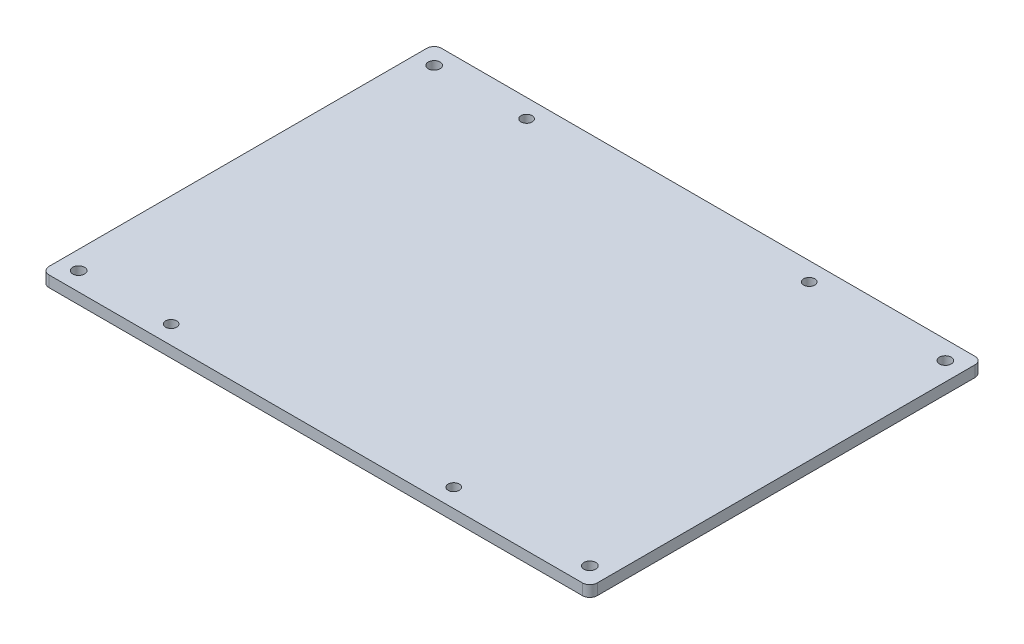
ISO-10303-21;
HEADER;
FILE_DESCRIPTION(('STEP AP214'),'2;1');
FILE_NAME('part.step','',(''),(''),'','','');
FILE_SCHEMA(('AUTOMOTIVE_DESIGN { 1 0 10303 214 1 1 1 1 }'));
ENDSEC;
DATA;
#1=APPLICATION_CONTEXT('core data for automotive mechanical design processes');
#2=APPLICATION_PROTOCOL_DEFINITION('international standard','automotive_design',2000,#1);
#3=PRODUCT_CONTEXT('',#1,'mechanical');
#4=PRODUCT('Part','Part','',(#3));
#5=PRODUCT_RELATED_PRODUCT_CATEGORY('part','',(#4));
#6=PRODUCT_DEFINITION_FORMATION('','',#4);
#7=PRODUCT_DEFINITION_CONTEXT('part definition',#1,'design');
#8=PRODUCT_DEFINITION('design','',#6,#7);
#9=PRODUCT_DEFINITION_SHAPE('','',#8);
#10=(LENGTH_UNIT() NAMED_UNIT(*) SI_UNIT(.MILLI.,.METRE.));
#11=(NAMED_UNIT(*) PLANE_ANGLE_UNIT() SI_UNIT($,.RADIAN.));
#12=(NAMED_UNIT(*) SI_UNIT($,.STERADIAN.) SOLID_ANGLE_UNIT());
#13=UNCERTAINTY_MEASURE_WITH_UNIT(LENGTH_MEASURE(1.E-05),#10,'distance_accuracy_value','');
#14=(GEOMETRIC_REPRESENTATION_CONTEXT(3) GLOBAL_UNCERTAINTY_ASSIGNED_CONTEXT((#13)) GLOBAL_UNIT_ASSIGNED_CONTEXT((#10,
#11,#12)) REPRESENTATION_CONTEXT('',''));
#15=CARTESIAN_POINT('',(0.,0.,0.));
#16=DIRECTION('',(0.,0.,1.));
#17=DIRECTION('',(1.,0.,0.));
#18=AXIS2_PLACEMENT_3D('',#15,#16,#17);
#19=CARTESIAN_POINT('',(0.,3.,0.));
#20=DIRECTION('',(0.,1.,0.));
#21=DIRECTION('',(0.,0.,1.));
#22=AXIS2_PLACEMENT_3D('',#19,#20,#21);
#23=PLANE('',#22);
#24=CARTESIAN_POINT('',(32.3000000000001,3.,-48.05));
#25=DIRECTION('',(0.,1.,0.));
#26=DIRECTION('',(0.,0.,1.));
#27=AXIS2_PLACEMENT_3D('',#24,#25,#26);
#28=CIRCLE('',#27,1.5);
#29=CARTESIAN_POINT('',(32.3000000000001,3.,-49.55));
#30=VERTEX_POINT('',#29);
#31=EDGE_CURVE('E220',#30,#30,#28,.F.);
#32=ORIENTED_EDGE('',*,*,#31,.T.);
#33=EDGE_LOOP('',(#32));
#34=FACE_BOUND('',#33,.T.);
#35=CARTESIAN_POINT('',(-44.1,3.,-48.0500000000001));
#36=DIRECTION('',(0.,1.,0.));
#37=DIRECTION('',(0.,0.,1.));
#38=AXIS2_PLACEMENT_3D('',#35,#36,#37);
#39=CIRCLE('',#38,1.5);
#40=CARTESIAN_POINT('',(-44.1,3.,-49.5500000000001));
#41=VERTEX_POINT('',#40);
#42=EDGE_CURVE('E214',#41,#41,#39,.F.);
#43=ORIENTED_EDGE('',*,*,#42,.T.);
#44=EDGE_LOOP('',(#43));
#45=FACE_BOUND('',#44,.T.);
#46=CARTESIAN_POINT('',(-44.1,3.,48.05));
#47=DIRECTION('',(0.,1.,0.));
#48=DIRECTION('',(0.,0.,1.));
#49=AXIS2_PLACEMENT_3D('',#46,#47,#48);
#50=CIRCLE('',#49,1.5);
#51=CARTESIAN_POINT('',(-44.1,3.,46.55));
#52=VERTEX_POINT('',#51);
#53=EDGE_CURVE('E208',#52,#52,#50,.F.);
#54=ORIENTED_EDGE('',*,*,#53,.T.);
#55=EDGE_LOOP('',(#54));
#56=FACE_BOUND('',#55,.T.);
#57=CARTESIAN_POINT('',(32.3,3.,48.05));
#58=DIRECTION('',(0.,1.,0.));
#59=DIRECTION('',(0.,0.,1.));
#60=AXIS2_PLACEMENT_3D('',#57,#58,#59);
#61=CIRCLE('',#60,1.5);
#62=CARTESIAN_POINT('',(32.3,3.,46.55));
#63=VERTEX_POINT('',#62);
#64=EDGE_CURVE('E202',#63,#63,#61,.F.);
#65=ORIENTED_EDGE('',*,*,#64,.T.);
#66=EDGE_LOOP('',(#65));
#67=FACE_BOUND('',#66,.T.);
#68=CARTESIAN_POINT('',(69.1,3.,48.05));
#69=DIRECTION('',(0.,1.,0.));
#70=DIRECTION('',(0.,0.,1.));
#71=AXIS2_PLACEMENT_3D('',#68,#69,#70);
#72=CIRCLE('',#71,1.60000000000001);
#73=CARTESIAN_POINT('',(69.1,3.,49.65));
#74=VERTEX_POINT('',#73);
#75=EDGE_CURVE('E187',#74,#74,#72,.T.);
#76=ORIENTED_EDGE('',*,*,#75,.F.);
#77=EDGE_LOOP('',(#76));
#78=FACE_BOUND('',#77,.T.);
#79=CARTESIAN_POINT('',(-69.1,3.,-48.05));
#80=DIRECTION('',(0.,1.,0.));
#81=DIRECTION('',(0.,0.,1.));
#82=AXIS2_PLACEMENT_3D('',#79,#80,#81);
#83=CIRCLE('',#82,1.60000000000001);
#84=CARTESIAN_POINT('',(-69.1,3.,-46.45));
#85=VERTEX_POINT('',#84);
#86=EDGE_CURVE('E173',#85,#85,#83,.T.);
#87=ORIENTED_EDGE('',*,*,#86,.F.);
#88=EDGE_LOOP('',(#87));
#89=FACE_BOUND('',#88,.T.);
#90=DIRECTION('',(1.,0.,0.));
#91=VECTOR('',#90,1.);
#92=CARTESIAN_POINT('',(-74.1,3.,53.05));
#93=LINE('',#92,#91);
#94=CARTESIAN_POINT('',(-72.1,3.,53.05));
#95=VERTEX_POINT('',#94);
#96=CARTESIAN_POINT('',(72.1,3.,53.05));
#97=VERTEX_POINT('',#96);
#98=EDGE_CURVE('E168',#95,#97,#93,.T.);
#99=ORIENTED_EDGE('',*,*,#98,.T.);
#100=CARTESIAN_POINT('',(72.1,3.,51.05));
#101=DIRECTION('',(0.,1.,0.));
#102=DIRECTION('',(0.,0.,1.));
#103=AXIS2_PLACEMENT_3D('',#100,#101,#102);
#104=CIRCLE('',#103,2.);
#105=CARTESIAN_POINT('',(74.1,3.,51.05));
#106=VERTEX_POINT('',#105);
#107=EDGE_CURVE('E149',#97,#106,#104,.T.);
#108=ORIENTED_EDGE('',*,*,#107,.T.);
#109=DIRECTION('',(0.,0.,-1.));
#110=VECTOR('',#109,1.);
#111=CARTESIAN_POINT('',(74.1,3.,-53.05));
#112=LINE('',#111,#110);
#113=CARTESIAN_POINT('',(74.1,3.,-51.05));
#114=VERTEX_POINT('',#113);
#115=EDGE_CURVE('E119',#106,#114,#112,.T.);
#116=ORIENTED_EDGE('',*,*,#115,.T.);
#117=CARTESIAN_POINT('',(72.1,3.,-51.05));
#118=DIRECTION('',(0.,1.,0.));
#119=DIRECTION('',(0.,0.,1.));
#120=AXIS2_PLACEMENT_3D('',#117,#118,#119);
#121=CIRCLE('',#120,2.);
#122=CARTESIAN_POINT('',(72.1,3.,-53.05));
#123=VERTEX_POINT('',#122);
#124=EDGE_CURVE('E55',#114,#123,#121,.T.);
#125=ORIENTED_EDGE('',*,*,#124,.T.);
#126=DIRECTION('',(-1.,0.,0.));
#127=VECTOR('',#126,1.);
#128=CARTESIAN_POINT('',(-74.1,3.,-53.05));
#129=LINE('',#128,#127);
#130=CARTESIAN_POINT('',(-72.1,3.,-53.05));
#131=VERTEX_POINT('',#130);
#132=EDGE_CURVE('E135',#123,#131,#129,.T.);
#133=ORIENTED_EDGE('',*,*,#132,.T.);
#134=CARTESIAN_POINT('',(-72.1,3.,-51.05));
#135=DIRECTION('',(0.,1.,0.));
#136=DIRECTION('',(0.,0.,1.));
#137=AXIS2_PLACEMENT_3D('',#134,#135,#136);
#138=CIRCLE('',#137,2.);
#139=CARTESIAN_POINT('',(-74.1,3.,-51.05));
#140=VERTEX_POINT('',#139);
#141=EDGE_CURVE('E146',#131,#140,#138,.T.);
#142=ORIENTED_EDGE('',*,*,#141,.T.);
#143=DIRECTION('',(0.,0.,1.));
#144=VECTOR('',#143,1.);
#145=CARTESIAN_POINT('',(-74.1,3.,-53.05));
#146=LINE('',#145,#144);
#147=CARTESIAN_POINT('',(-74.1,3.,51.05));
#148=VERTEX_POINT('',#147);
#149=EDGE_CURVE('E129',#140,#148,#146,.T.);
#150=ORIENTED_EDGE('',*,*,#149,.T.);
#151=CARTESIAN_POINT('',(-72.1,3.,51.05));
#152=DIRECTION('',(0.,1.,0.));
#153=DIRECTION('',(0.,0.,1.));
#154=AXIS2_PLACEMENT_3D('',#151,#152,#153);
#155=CIRCLE('',#154,2.);
#156=EDGE_CURVE('E144',#148,#95,#155,.T.);
#157=ORIENTED_EDGE('',*,*,#156,.T.);
#158=EDGE_LOOP('',(#99,#108,#116,#125,#133,#142,#150,#157));
#159=FACE_BOUND('',#158,.T.);
#160=CARTESIAN_POINT('',(-69.1,3.,48.05));
#161=DIRECTION('',(0.,1.,0.));
#162=DIRECTION('',(0.,0.,-1.));
#163=AXIS2_PLACEMENT_3D('',#160,#161,#162);
#164=CIRCLE('',#163,1.60000000000001);
#165=CARTESIAN_POINT('',(-69.1,3.,46.45));
#166=VERTEX_POINT('',#165);
#167=EDGE_CURVE('E182',#166,#166,#164,.T.);
#168=ORIENTED_EDGE('',*,*,#167,.F.);
#169=EDGE_LOOP('',(#168));
#170=FACE_BOUND('',#169,.T.);
#171=CARTESIAN_POINT('',(69.1,3.,-48.05));
#172=DIRECTION('',(0.,1.,0.));
#173=DIRECTION('',(0.,0.,-1.));
#174=AXIS2_PLACEMENT_3D('',#171,#172,#173);
#175=CIRCLE('',#174,1.60000000000001);
#176=CARTESIAN_POINT('',(69.1,3.,-49.65));
#177=VERTEX_POINT('',#176);
#178=EDGE_CURVE('E193',#177,#177,#175,.T.);
#179=ORIENTED_EDGE('',*,*,#178,.F.);
#180=EDGE_LOOP('',(#179));
#181=FACE_BOUND('',#180,.T.);
#182=ADVANCED_FACE('F33',(#34,#45,#56,#67,#78,#89,#159,#170,#181),#23,.T.);
#183=CARTESIAN_POINT('',(0.,0.,0.));
#184=DIRECTION('',(0.,1.,0.));
#185=DIRECTION('',(0.,0.,1.));
#186=AXIS2_PLACEMENT_3D('',#183,#184,#185);
#187=PLANE('',#186);
#188=CARTESIAN_POINT('',(32.3000000000001,0.,-48.05));
#189=DIRECTION('',(0.,-1.,0.));
#190=DIRECTION('',(0.,0.,1.));
#191=AXIS2_PLACEMENT_3D('',#188,#189,#190);
#192=CIRCLE('',#191,1.5);
#193=CARTESIAN_POINT('',(32.3000000000001,0.,-49.55));
#194=VERTEX_POINT('',#193);
#195=EDGE_CURVE('E217',#194,#194,#192,.T.);
#196=ORIENTED_EDGE('',*,*,#195,.F.);
#197=EDGE_LOOP('',(#196));
#198=FACE_BOUND('',#197,.T.);
#199=CARTESIAN_POINT('',(-44.1,0.,-48.0500000000001));
#200=DIRECTION('',(0.,-1.,0.));
#201=DIRECTION('',(0.,0.,1.));
#202=AXIS2_PLACEMENT_3D('',#199,#200,#201);
#203=CIRCLE('',#202,1.5);
#204=CARTESIAN_POINT('',(-44.1,0.,-49.5500000000001));
#205=VERTEX_POINT('',#204);
#206=EDGE_CURVE('E211',#205,#205,#203,.T.);
#207=ORIENTED_EDGE('',*,*,#206,.F.);
#208=EDGE_LOOP('',(#207));
#209=FACE_BOUND('',#208,.T.);
#210=CARTESIAN_POINT('',(-44.1,0.,48.05));
#211=DIRECTION('',(0.,-1.,0.));
#212=DIRECTION('',(0.,0.,-1.));
#213=AXIS2_PLACEMENT_3D('',#210,#211,#212);
#214=CIRCLE('',#213,1.5);
#215=CARTESIAN_POINT('',(-44.1,0.,46.55));
#216=VERTEX_POINT('',#215);
#217=EDGE_CURVE('E205',#216,#216,#214,.T.);
#218=ORIENTED_EDGE('',*,*,#217,.F.);
#219=EDGE_LOOP('',(#218));
#220=FACE_BOUND('',#219,.T.);
#221=CARTESIAN_POINT('',(32.3,0.,48.05));
#222=DIRECTION('',(0.,-1.,0.));
#223=DIRECTION('',(0.,0.,-1.));
#224=AXIS2_PLACEMENT_3D('',#221,#222,#223);
#225=CIRCLE('',#224,1.5);
#226=CARTESIAN_POINT('',(32.3,0.,46.55));
#227=VERTEX_POINT('',#226);
#228=EDGE_CURVE('E199',#227,#227,#225,.T.);
#229=ORIENTED_EDGE('',*,*,#228,.F.);
#230=EDGE_LOOP('',(#229));
#231=FACE_BOUND('',#230,.T.);
#232=DIRECTION('',(0.,0.,-1.));
#233=VECTOR('',#232,1.);
#234=CARTESIAN_POINT('',(74.1,0.,-53.05));
#235=LINE('',#234,#233);
#236=CARTESIAN_POINT('',(74.1,0.,51.05));
#237=VERTEX_POINT('',#236);
#238=CARTESIAN_POINT('',(74.1,0.,-51.05));
#239=VERTEX_POINT('',#238);
#240=EDGE_CURVE('E117',#237,#239,#235,.T.);
#241=ORIENTED_EDGE('',*,*,#240,.F.);
#242=CARTESIAN_POINT('',(72.1,0.,51.05));
#243=DIRECTION('',(0.,1.,0.));
#244=DIRECTION('',(0.,0.,1.));
#245=AXIS2_PLACEMENT_3D('',#242,#243,#244);
#246=CIRCLE('',#245,2.);
#247=CARTESIAN_POINT('',(72.1,0.,53.05));
#248=VERTEX_POINT('',#247);
#249=EDGE_CURVE('E100',#237,#248,#246,.F.);
#250=ORIENTED_EDGE('',*,*,#249,.T.);
#251=DIRECTION('',(1.,0.,0.));
#252=VECTOR('',#251,1.);
#253=CARTESIAN_POINT('',(-74.1,0.,53.05));
#254=LINE('',#253,#252);
#255=CARTESIAN_POINT('',(-72.1,0.,53.05));
#256=VERTEX_POINT('',#255);
#257=EDGE_CURVE('E127',#256,#248,#254,.T.);
#258=ORIENTED_EDGE('',*,*,#257,.F.);
#259=CARTESIAN_POINT('',(-72.1,0.,51.05));
#260=DIRECTION('',(0.,1.,0.));
#261=DIRECTION('',(0.,0.,1.));
#262=AXIS2_PLACEMENT_3D('',#259,#260,#261);
#263=CIRCLE('',#262,2.);
#264=CARTESIAN_POINT('',(-74.1,0.,51.05));
#265=VERTEX_POINT('',#264);
#266=EDGE_CURVE('E120',#256,#265,#263,.F.);
#267=ORIENTED_EDGE('',*,*,#266,.T.);
#268=DIRECTION('',(0.,0.,1.));
#269=VECTOR('',#268,1.);
#270=CARTESIAN_POINT('',(-74.1,0.,-53.05));
#271=LINE('',#270,#269);
#272=CARTESIAN_POINT('',(-74.1,0.,-51.05));
#273=VERTEX_POINT('',#272);
#274=EDGE_CURVE('E131',#273,#265,#271,.T.);
#275=ORIENTED_EDGE('',*,*,#274,.F.);
#276=CARTESIAN_POINT('',(-72.1,0.,-51.05));
#277=DIRECTION('',(0.,1.,0.));
#278=DIRECTION('',(0.,0.,1.));
#279=AXIS2_PLACEMENT_3D('',#276,#277,#278);
#280=CIRCLE('',#279,2.);
#281=CARTESIAN_POINT('',(-72.1,0.,-53.05));
#282=VERTEX_POINT('',#281);
#283=EDGE_CURVE('E138',#273,#282,#280,.F.);
#284=ORIENTED_EDGE('',*,*,#283,.T.);
#285=DIRECTION('',(-1.,0.,0.));
#286=VECTOR('',#285,1.);
#287=CARTESIAN_POINT('',(-74.1,0.,-53.05));
#288=LINE('',#287,#286);
#289=CARTESIAN_POINT('',(72.1,0.,-53.05));
#290=VERTEX_POINT('',#289);
#291=EDGE_CURVE('E126',#290,#282,#288,.T.);
#292=ORIENTED_EDGE('',*,*,#291,.F.);
#293=CARTESIAN_POINT('',(72.1,0.,-51.05));
#294=DIRECTION('',(0.,1.,0.));
#295=DIRECTION('',(0.,0.,1.));
#296=AXIS2_PLACEMENT_3D('',#293,#294,#295);
#297=CIRCLE('',#296,2.);
#298=EDGE_CURVE('E111',#290,#239,#297,.F.);
#299=ORIENTED_EDGE('',*,*,#298,.T.);
#300=EDGE_LOOP('',(#241,#250,#258,#267,#275,#284,#292,#299));
#301=FACE_BOUND('',#300,.T.);
#302=CARTESIAN_POINT('',(-69.1,0.,-48.05));
#303=DIRECTION('',(0.,1.,0.));
#304=DIRECTION('',(0.,0.,1.));
#305=AXIS2_PLACEMENT_3D('',#302,#303,#304);
#306=CIRCLE('',#305,1.60000000000001);
#307=CARTESIAN_POINT('',(-69.1,0.,-46.45));
#308=VERTEX_POINT('',#307);
#309=EDGE_CURVE('E175',#308,#308,#306,.T.);
#310=ORIENTED_EDGE('',*,*,#309,.T.);
#311=EDGE_LOOP('',(#310));
#312=FACE_BOUND('',#311,.T.);
#313=CARTESIAN_POINT('',(-69.1,0.,48.05));
#314=DIRECTION('',(0.,1.,0.));
#315=DIRECTION('',(0.,0.,-1.));
#316=AXIS2_PLACEMENT_3D('',#313,#314,#315);
#317=CIRCLE('',#316,1.60000000000001);
#318=CARTESIAN_POINT('',(-69.1,0.,46.45));
#319=VERTEX_POINT('',#318);
#320=EDGE_CURVE('E184',#319,#319,#317,.T.);
#321=ORIENTED_EDGE('',*,*,#320,.T.);
#322=EDGE_LOOP('',(#321));
#323=FACE_BOUND('',#322,.T.);
#324=CARTESIAN_POINT('',(69.1,0.,48.05));
#325=DIRECTION('',(0.,1.,0.));
#326=DIRECTION('',(0.,0.,1.));
#327=AXIS2_PLACEMENT_3D('',#324,#325,#326);
#328=CIRCLE('',#327,1.60000000000001);
#329=CARTESIAN_POINT('',(69.1,0.,49.65));
#330=VERTEX_POINT('',#329);
#331=EDGE_CURVE('E190',#330,#330,#328,.T.);
#332=ORIENTED_EDGE('',*,*,#331,.T.);
#333=EDGE_LOOP('',(#332));
#334=FACE_BOUND('',#333,.T.);
#335=CARTESIAN_POINT('',(69.1,0.,-48.05));
#336=DIRECTION('',(0.,1.,0.));
#337=DIRECTION('',(0.,0.,-1.));
#338=AXIS2_PLACEMENT_3D('',#335,#336,#337);
#339=CIRCLE('',#338,1.60000000000001);
#340=CARTESIAN_POINT('',(69.1,0.,-49.65));
#341=VERTEX_POINT('',#340);
#342=EDGE_CURVE('E196',#341,#341,#339,.T.);
#343=ORIENTED_EDGE('',*,*,#342,.T.);
#344=EDGE_LOOP('',(#343));
#345=FACE_BOUND('',#344,.T.);
#346=ADVANCED_FACE('F123',(#198,#209,#220,#231,#301,#312,#323,#334,#345),#187,.F.);
#347=CARTESIAN_POINT('',(-74.1,3.,-53.05));
#348=DIRECTION('',(1.,0.,0.));
#349=DIRECTION('',(0.,0.,-1.));
#350=AXIS2_PLACEMENT_3D('',#347,#348,#349);
#351=PLANE('',#350);
#352=ORIENTED_EDGE('',*,*,#149,.F.);
#353=DIRECTION('',(0.,-1.,0.));
#354=VECTOR('',#353,1.);
#355=CARTESIAN_POINT('',(-74.1,3.,-51.05));
#356=LINE('',#355,#354);
#357=EDGE_CURVE('E11',#140,#273,#356,.T.);
#358=ORIENTED_EDGE('',*,*,#357,.T.);
#359=ORIENTED_EDGE('',*,*,#274,.T.);
#360=DIRECTION('',(0.,-1.,0.));
#361=VECTOR('',#360,1.);
#362=CARTESIAN_POINT('',(-74.1,3.,51.05));
#363=LINE('',#362,#361);
#364=EDGE_CURVE('E41',#265,#148,#363,.F.);
#365=ORIENTED_EDGE('',*,*,#364,.T.);
#366=EDGE_LOOP('',(#352,#358,#359,#365));
#367=FACE_BOUND('',#366,.T.);
#368=ADVANCED_FACE('F159',(#367),#351,.F.);
#369=CARTESIAN_POINT('',(-74.1,3.,53.05));
#370=DIRECTION('',(0.,0.,-1.));
#371=DIRECTION('',(-1.,0.,0.));
#372=AXIS2_PLACEMENT_3D('',#369,#370,#371);
#373=PLANE('',#372);
#374=ORIENTED_EDGE('',*,*,#257,.T.);
#375=DIRECTION('',(0.,-1.,0.));
#376=VECTOR('',#375,1.);
#377=CARTESIAN_POINT('',(72.1,3.,53.05));
#378=LINE('',#377,#376);
#379=EDGE_CURVE('E105',#248,#97,#378,.F.);
#380=ORIENTED_EDGE('',*,*,#379,.T.);
#381=ORIENTED_EDGE('',*,*,#98,.F.);
#382=DIRECTION('',(0.,-1.,0.));
#383=VECTOR('',#382,1.);
#384=CARTESIAN_POINT('',(-72.1,3.,53.05));
#385=LINE('',#384,#383);
#386=EDGE_CURVE('E110',#95,#256,#385,.T.);
#387=ORIENTED_EDGE('',*,*,#386,.T.);
#388=EDGE_LOOP('',(#374,#380,#381,#387));
#389=FACE_BOUND('',#388,.T.);
#390=ADVANCED_FACE('F172',(#389),#373,.F.);
#391=CARTESIAN_POINT('',(74.1,3.,-53.05));
#392=DIRECTION('',(-1.,0.,0.));
#393=DIRECTION('',(0.,0.,1.));
#394=AXIS2_PLACEMENT_3D('',#391,#392,#393);
#395=PLANE('',#394);
#396=ORIENTED_EDGE('',*,*,#115,.F.);
#397=DIRECTION('',(0.,-1.,0.));
#398=VECTOR('',#397,1.);
#399=CARTESIAN_POINT('',(74.1,3.,51.05));
#400=LINE('',#399,#398);
#401=EDGE_CURVE('E104',#106,#237,#400,.T.);
#402=ORIENTED_EDGE('',*,*,#401,.T.);
#403=ORIENTED_EDGE('',*,*,#240,.T.);
#404=DIRECTION('',(0.,-1.,0.));
#405=VECTOR('',#404,1.);
#406=CARTESIAN_POINT('',(74.1,3.,-51.05));
#407=LINE('',#406,#405);
#408=EDGE_CURVE('E121',#239,#114,#407,.F.);
#409=ORIENTED_EDGE('',*,*,#408,.T.);
#410=EDGE_LOOP('',(#396,#402,#403,#409));
#411=FACE_BOUND('',#410,.T.);
#412=ADVANCED_FACE('F116',(#411),#395,.F.);
#413=CARTESIAN_POINT('',(-74.1,3.,-53.05));
#414=DIRECTION('',(0.,0.,1.));
#415=DIRECTION('',(1.,0.,0.));
#416=AXIS2_PLACEMENT_3D('',#413,#414,#415);
#417=PLANE('',#416);
#418=ORIENTED_EDGE('',*,*,#132,.F.);
#419=DIRECTION('',(0.,-1.,0.));
#420=VECTOR('',#419,1.);
#421=CARTESIAN_POINT('',(72.1,3.,-53.05));
#422=LINE('',#421,#420);
#423=EDGE_CURVE('E152',#123,#290,#422,.T.);
#424=ORIENTED_EDGE('',*,*,#423,.T.);
#425=ORIENTED_EDGE('',*,*,#291,.T.);
#426=DIRECTION('',(0.,-1.,0.));
#427=VECTOR('',#426,1.);
#428=CARTESIAN_POINT('',(-72.1,3.,-53.05));
#429=LINE('',#428,#427);
#430=EDGE_CURVE('E48',#282,#131,#429,.F.);
#431=ORIENTED_EDGE('',*,*,#430,.T.);
#432=EDGE_LOOP('',(#418,#424,#425,#431));
#433=FACE_BOUND('',#432,.T.);
#434=ADVANCED_FACE('F262',(#433),#417,.F.);
#435=CARTESIAN_POINT('',(-69.1,3.,-48.05));
#436=DIRECTION('',(0.,-1.,0.));
#437=DIRECTION('',(0.,0.,-1.));
#438=AXIS2_PLACEMENT_3D('',#435,#436,#437);
#439=CYLINDRICAL_SURFACE('',#438,1.60000000000001);
#440=ORIENTED_EDGE('',*,*,#86,.T.);
#441=EDGE_LOOP('',(#440));
#442=FACE_BOUND('',#441,.T.);
#443=ORIENTED_EDGE('',*,*,#309,.F.);
#444=EDGE_LOOP('',(#443));
#445=FACE_BOUND('',#444,.T.);
#446=ADVANCED_FACE('F259',(#442,#445),#439,.F.);
#447=CARTESIAN_POINT('',(-69.1,3.,48.05));
#448=DIRECTION('',(0.,-1.,0.));
#449=DIRECTION('',(0.,0.,-1.));
#450=AXIS2_PLACEMENT_3D('',#447,#448,#449);
#451=CYLINDRICAL_SURFACE('',#450,1.60000000000001);
#452=ORIENTED_EDGE('',*,*,#167,.T.);
#453=EDGE_LOOP('',(#452));
#454=FACE_BOUND('',#453,.T.);
#455=ORIENTED_EDGE('',*,*,#320,.F.);
#456=EDGE_LOOP('',(#455));
#457=FACE_BOUND('',#456,.T.);
#458=ADVANCED_FACE('F343',(#454,#457),#451,.F.);
#459=CARTESIAN_POINT('',(69.1,3.,48.05));
#460=DIRECTION('',(0.,-1.,0.));
#461=DIRECTION('',(0.,0.,-1.));
#462=AXIS2_PLACEMENT_3D('',#459,#460,#461);
#463=CYLINDRICAL_SURFACE('',#462,1.60000000000001);
#464=ORIENTED_EDGE('',*,*,#75,.T.);
#465=EDGE_LOOP('',(#464));
#466=FACE_BOUND('',#465,.T.);
#467=ORIENTED_EDGE('',*,*,#331,.F.);
#468=EDGE_LOOP('',(#467));
#469=FACE_BOUND('',#468,.T.);
#470=ADVANCED_FACE('F353',(#466,#469),#463,.F.);
#471=CARTESIAN_POINT('',(69.1,3.,-48.05));
#472=DIRECTION('',(0.,-1.,0.));
#473=DIRECTION('',(0.,0.,-1.));
#474=AXIS2_PLACEMENT_3D('',#471,#472,#473);
#475=CYLINDRICAL_SURFACE('',#474,1.60000000000001);
#476=ORIENTED_EDGE('',*,*,#178,.T.);
#477=EDGE_LOOP('',(#476));
#478=FACE_BOUND('',#477,.T.);
#479=ORIENTED_EDGE('',*,*,#342,.F.);
#480=EDGE_LOOP('',(#479));
#481=FACE_BOUND('',#480,.T.);
#482=ADVANCED_FACE('F274',(#478,#481),#475,.F.);
#483=CARTESIAN_POINT('',(72.1,3.,51.05));
#484=DIRECTION('',(0.,-1.,0.));
#485=DIRECTION('',(0.,0.,-1.));
#486=AXIS2_PLACEMENT_3D('',#483,#484,#485);
#487=CYLINDRICAL_SURFACE('',#486,2.);
#488=ORIENTED_EDGE('',*,*,#107,.F.);
#489=ORIENTED_EDGE('',*,*,#379,.F.);
#490=ORIENTED_EDGE('',*,*,#249,.F.);
#491=ORIENTED_EDGE('',*,*,#401,.F.);
#492=EDGE_LOOP('',(#488,#489,#490,#491));
#493=FACE_BOUND('',#492,.T.);
#494=ADVANCED_FACE('F103',(#493),#487,.T.);
#495=CARTESIAN_POINT('',(72.1,3.,-51.05));
#496=DIRECTION('',(0.,-1.,0.));
#497=DIRECTION('',(0.,0.,-1.));
#498=AXIS2_PLACEMENT_3D('',#495,#496,#497);
#499=CYLINDRICAL_SURFACE('',#498,2.);
#500=ORIENTED_EDGE('',*,*,#124,.F.);
#501=ORIENTED_EDGE('',*,*,#408,.F.);
#502=ORIENTED_EDGE('',*,*,#298,.F.);
#503=ORIENTED_EDGE('',*,*,#423,.F.);
#504=EDGE_LOOP('',(#500,#501,#502,#503));
#505=FACE_BOUND('',#504,.T.);
#506=ADVANCED_FACE('F273',(#505),#499,.T.);
#507=CARTESIAN_POINT('',(-72.1,3.,-51.05));
#508=DIRECTION('',(0.,-1.,0.));
#509=DIRECTION('',(0.,0.,-1.));
#510=AXIS2_PLACEMENT_3D('',#507,#508,#509);
#511=CYLINDRICAL_SURFACE('',#510,2.);
#512=ORIENTED_EDGE('',*,*,#141,.F.);
#513=ORIENTED_EDGE('',*,*,#430,.F.);
#514=ORIENTED_EDGE('',*,*,#283,.F.);
#515=ORIENTED_EDGE('',*,*,#357,.F.);
#516=EDGE_LOOP('',(#512,#513,#514,#515));
#517=FACE_BOUND('',#516,.T.);
#518=ADVANCED_FACE('F249',(#517),#511,.T.);
#519=CARTESIAN_POINT('',(-72.1,3.,51.05));
#520=DIRECTION('',(0.,-1.,0.));
#521=DIRECTION('',(0.,0.,-1.));
#522=AXIS2_PLACEMENT_3D('',#519,#520,#521);
#523=CYLINDRICAL_SURFACE('',#522,2.);
#524=ORIENTED_EDGE('',*,*,#156,.F.);
#525=ORIENTED_EDGE('',*,*,#364,.F.);
#526=ORIENTED_EDGE('',*,*,#266,.F.);
#527=ORIENTED_EDGE('',*,*,#386,.F.);
#528=EDGE_LOOP('',(#524,#525,#526,#527));
#529=FACE_BOUND('',#528,.T.);
#530=ADVANCED_FACE('F35',(#529),#523,.T.);
#531=CARTESIAN_POINT('',(32.3,3.001,48.05));
#532=DIRECTION('',(0.,-1.,0.));
#533=DIRECTION('',(0.,0.,-1.));
#534=AXIS2_PLACEMENT_3D('',#531,#532,#533);
#535=CYLINDRICAL_SURFACE('',#534,1.5);
#536=CARTESIAN_POINT('',(32.3,3.,46.55));
#537=CARTESIAN_POINT('',(32.3,2.96875,46.55));
#538=CARTESIAN_POINT('',(32.3,2.9375,46.55));
#539=CARTESIAN_POINT('',(32.3,2.875,46.55));
#540=CARTESIAN_POINT('',(32.3,2.84375,46.55));
#541=CARTESIAN_POINT('',(32.3,2.78125,46.55));
#542=CARTESIAN_POINT('',(32.3,2.75,46.55));
#543=CARTESIAN_POINT('',(32.3,2.6875,46.55));
#544=CARTESIAN_POINT('',(32.3,2.65625,46.55));
#545=CARTESIAN_POINT('',(32.3,2.59375,46.55));
#546=CARTESIAN_POINT('',(32.3,2.5625,46.55));
#547=CARTESIAN_POINT('',(32.3,2.5,46.55));
#548=CARTESIAN_POINT('',(32.3,2.46875,46.55));
#549=CARTESIAN_POINT('',(32.3,2.40625,46.55));
#550=CARTESIAN_POINT('',(32.3,2.375,46.55));
#551=CARTESIAN_POINT('',(32.3,2.3125,46.55));
#552=CARTESIAN_POINT('',(32.3,2.28125,46.55));
#553=CARTESIAN_POINT('',(32.3,2.21875,46.55));
#554=CARTESIAN_POINT('',(32.3,2.1875,46.55));
#555=CARTESIAN_POINT('',(32.3,2.125,46.55));
#556=CARTESIAN_POINT('',(32.3,2.09375,46.55));
#557=CARTESIAN_POINT('',(32.3,2.03125,46.55));
#558=CARTESIAN_POINT('',(32.3,2.,46.55));
#559=CARTESIAN_POINT('',(32.3,1.9375,46.55));
#560=CARTESIAN_POINT('',(32.3,1.90625,46.55));
#561=CARTESIAN_POINT('',(32.3,1.84375,46.55));
#562=CARTESIAN_POINT('',(32.3,1.8125,46.55));
#563=CARTESIAN_POINT('',(32.3,1.75,46.55));
#564=CARTESIAN_POINT('',(32.3,1.71875,46.55));
#565=CARTESIAN_POINT('',(32.3,1.65625,46.55));
#566=CARTESIAN_POINT('',(32.3,1.625,46.55));
#567=CARTESIAN_POINT('',(32.3,1.5625,46.55));
#568=CARTESIAN_POINT('',(32.3,1.53125,46.55));
#569=CARTESIAN_POINT('',(32.3,1.46875,46.55));
#570=CARTESIAN_POINT('',(32.3,1.4375,46.55));
#571=CARTESIAN_POINT('',(32.3,1.375,46.55));
#572=CARTESIAN_POINT('',(32.3,1.34375,46.55));
#573=CARTESIAN_POINT('',(32.3,1.28125,46.55));
#574=CARTESIAN_POINT('',(32.3,1.25,46.55));
#575=CARTESIAN_POINT('',(32.3,1.1875,46.55));
#576=CARTESIAN_POINT('',(32.3,1.15625,46.55));
#577=CARTESIAN_POINT('',(32.3,1.09375,46.55));
#578=CARTESIAN_POINT('',(32.3,1.0625,46.55));
#579=CARTESIAN_POINT('',(32.3,1.,46.55));
#580=CARTESIAN_POINT('',(32.3,0.96875,46.55));
#581=CARTESIAN_POINT('',(32.3,0.90625,46.55));
#582=CARTESIAN_POINT('',(32.3,0.875,46.55));
#583=CARTESIAN_POINT('',(32.3,0.8125,46.55));
#584=CARTESIAN_POINT('',(32.3,0.78125,46.55));
#585=CARTESIAN_POINT('',(32.3,0.71875,46.55));
#586=CARTESIAN_POINT('',(32.3,0.6875,46.55));
#587=CARTESIAN_POINT('',(32.3,0.625,46.55));
#588=CARTESIAN_POINT('',(32.3,0.59375,46.55));
#589=CARTESIAN_POINT('',(32.3,0.53125,46.55));
#590=CARTESIAN_POINT('',(32.3,0.5,46.55));
#591=CARTESIAN_POINT('',(32.3,0.4375,46.55));
#592=CARTESIAN_POINT('',(32.3,0.40625,46.55));
#593=CARTESIAN_POINT('',(32.3,0.34375,46.55));
#594=CARTESIAN_POINT('',(32.3,0.3125,46.55));
#595=CARTESIAN_POINT('',(32.3,0.25,46.55));
#596=CARTESIAN_POINT('',(32.3,0.21875,46.55));
#597=CARTESIAN_POINT('',(32.3,0.156250000000001,46.55));
#598=CARTESIAN_POINT('',(32.3,0.125000000000001,46.55));
#599=CARTESIAN_POINT('',(32.3,0.0625000000000005,46.55));
#600=CARTESIAN_POINT('',(32.3,0.0312500000000005,46.55));
#601=CARTESIAN_POINT('',(32.3,0.,46.55));
#602=B_SPLINE_CURVE_WITH_KNOTS('',3,(#536,#537,#538,#539,#540,#541,#542,#543,#544,#545,#546,
#547,#548,#549,#550,#551,#552,#553,#554,#555,#556,#557,#558,#559,#560,#561,#562,#563,#564,#565,
#566,#567,#568,#569,#570,#571,#572,#573,#574,#575,#576,#577,#578,#579,#580,#581,#582,#583,#584,
#585,#586,#587,#588,#589,#590,#591,#592,#593,#594,#595,#596,#597,#598,#599,#600,#601),
.UNSPECIFIED.,.F.,.F.,(4,2,2,2,2,2,2,2,2,2,2,2,2,2,2,2,2,2,2,2,2,2,2,2,2,2,2,2,2,2,2,2,4),(0.,
0.0937499999999997,0.1875,0.28125,0.375,0.46875,0.5625,0.65625,0.749999999999999,
0.843749999999999,0.9375,1.03125,1.125,1.21875,1.3125,1.40625,1.5,1.59375,1.6875,1.78125,1.875,
1.96875,2.0625,2.15625,2.25,2.34375,2.4375,2.53125,2.625,2.71875,2.8125,2.90625,3.),.UNSPECIFIED.);
#603=EDGE_CURVE('BSEAM237',#63,#227,#602,.T.);
#604=ORIENTED_EDGE('',*,*,#64,.F.);
#605=ORIENTED_EDGE('',*,*,#228,.T.);
#606=ORIENTED_EDGE('',*,*,#603,.T.);
#607=ORIENTED_EDGE('',*,*,#603,.F.);
#608=EDGE_LOOP('',(#604,#606,#605,#607));
#609=FACE_BOUND('',#608,.T.);
#610=ADVANCED_FACE('F237',(#609),#535,.F.);
#611=CARTESIAN_POINT('',(-44.1,3.001,48.05));
#612=DIRECTION('',(0.,-1.,0.));
#613=DIRECTION('',(0.,0.,-1.));
#614=AXIS2_PLACEMENT_3D('',#611,#612,#613);
#615=CYLINDRICAL_SURFACE('',#614,1.5);
#616=CARTESIAN_POINT('',(-44.1,3.,46.55));
#617=CARTESIAN_POINT('',(-44.1,2.96875,46.55));
#618=CARTESIAN_POINT('',(-44.1,2.9375,46.55));
#619=CARTESIAN_POINT('',(-44.1,2.875,46.55));
#620=CARTESIAN_POINT('',(-44.1,2.84375,46.55));
#621=CARTESIAN_POINT('',(-44.1,2.78125,46.55));
#622=CARTESIAN_POINT('',(-44.1,2.75,46.55));
#623=CARTESIAN_POINT('',(-44.1,2.6875,46.55));
#624=CARTESIAN_POINT('',(-44.1,2.65625,46.55));
#625=CARTESIAN_POINT('',(-44.1,2.59375,46.55));
#626=CARTESIAN_POINT('',(-44.1,2.5625,46.55));
#627=CARTESIAN_POINT('',(-44.1,2.5,46.55));
#628=CARTESIAN_POINT('',(-44.1,2.46875,46.55));
#629=CARTESIAN_POINT('',(-44.1,2.40625,46.55));
#630=CARTESIAN_POINT('',(-44.1,2.375,46.55));
#631=CARTESIAN_POINT('',(-44.1,2.3125,46.55));
#632=CARTESIAN_POINT('',(-44.1,2.28125,46.55));
#633=CARTESIAN_POINT('',(-44.1,2.21875,46.55));
#634=CARTESIAN_POINT('',(-44.1,2.1875,46.55));
#635=CARTESIAN_POINT('',(-44.1,2.125,46.55));
#636=CARTESIAN_POINT('',(-44.1,2.09375,46.55));
#637=CARTESIAN_POINT('',(-44.1,2.03125,46.55));
#638=CARTESIAN_POINT('',(-44.1,2.,46.55));
#639=CARTESIAN_POINT('',(-44.1,1.9375,46.55));
#640=CARTESIAN_POINT('',(-44.1,1.90625,46.55));
#641=CARTESIAN_POINT('',(-44.1,1.84375,46.55));
#642=CARTESIAN_POINT('',(-44.1,1.8125,46.55));
#643=CARTESIAN_POINT('',(-44.1,1.75,46.55));
#644=CARTESIAN_POINT('',(-44.1,1.71875,46.55));
#645=CARTESIAN_POINT('',(-44.1,1.65625,46.55));
#646=CARTESIAN_POINT('',(-44.1,1.625,46.55));
#647=CARTESIAN_POINT('',(-44.1,1.5625,46.55));
#648=CARTESIAN_POINT('',(-44.1,1.53125,46.55));
#649=CARTESIAN_POINT('',(-44.1,1.46875,46.55));
#650=CARTESIAN_POINT('',(-44.1,1.4375,46.55));
#651=CARTESIAN_POINT('',(-44.1,1.375,46.55));
#652=CARTESIAN_POINT('',(-44.1,1.34375,46.55));
#653=CARTESIAN_POINT('',(-44.1,1.28125,46.55));
#654=CARTESIAN_POINT('',(-44.1,1.25,46.55));
#655=CARTESIAN_POINT('',(-44.1,1.1875,46.55));
#656=CARTESIAN_POINT('',(-44.1,1.15625,46.55));
#657=CARTESIAN_POINT('',(-44.1,1.09375,46.55));
#658=CARTESIAN_POINT('',(-44.1,1.0625,46.55));
#659=CARTESIAN_POINT('',(-44.1,1.,46.55));
#660=CARTESIAN_POINT('',(-44.1,0.96875,46.55));
#661=CARTESIAN_POINT('',(-44.1,0.90625,46.55));
#662=CARTESIAN_POINT('',(-44.1,0.875,46.55));
#663=CARTESIAN_POINT('',(-44.1,0.8125,46.55));
#664=CARTESIAN_POINT('',(-44.1,0.78125,46.55));
#665=CARTESIAN_POINT('',(-44.1,0.71875,46.55));
#666=CARTESIAN_POINT('',(-44.1,0.6875,46.55));
#667=CARTESIAN_POINT('',(-44.1,0.625,46.55));
#668=CARTESIAN_POINT('',(-44.1,0.59375,46.55));
#669=CARTESIAN_POINT('',(-44.1,0.53125,46.55));
#670=CARTESIAN_POINT('',(-44.1,0.5,46.55));
#671=CARTESIAN_POINT('',(-44.1,0.4375,46.55));
#672=CARTESIAN_POINT('',(-44.1,0.40625,46.55));
#673=CARTESIAN_POINT('',(-44.1,0.34375,46.55));
#674=CARTESIAN_POINT('',(-44.1,0.3125,46.55));
#675=CARTESIAN_POINT('',(-44.1,0.25,46.55));
#676=CARTESIAN_POINT('',(-44.1,0.21875,46.55));
#677=CARTESIAN_POINT('',(-44.1,0.156250000000001,46.55));
#678=CARTESIAN_POINT('',(-44.1,0.125000000000001,46.55));
#679=CARTESIAN_POINT('',(-44.1,0.0625000000000005,46.55));
#680=CARTESIAN_POINT('',(-44.1,0.0312500000000005,46.55));
#681=CARTESIAN_POINT('',(-44.1,0.,46.55));
#682=B_SPLINE_CURVE_WITH_KNOTS('',3,(#616,#617,#618,#619,#620,#621,#622,#623,#624,#625,#626,
#627,#628,#629,#630,#631,#632,#633,#634,#635,#636,#637,#638,#639,#640,#641,#642,#643,#644,#645,
#646,#647,#648,#649,#650,#651,#652,#653,#654,#655,#656,#657,#658,#659,#660,#661,#662,#663,#664,
#665,#666,#667,#668,#669,#670,#671,#672,#673,#674,#675,#676,#677,#678,#679,#680,#681),
.UNSPECIFIED.,.F.,.F.,(4,2,2,2,2,2,2,2,2,2,2,2,2,2,2,2,2,2,2,2,2,2,2,2,2,2,2,2,2,2,2,2,4),(0.,
0.0937499999999997,0.1875,0.28125,0.375,0.46875,0.5625,0.65625,0.749999999999999,
0.843749999999999,0.9375,1.03125,1.125,1.21875,1.3125,1.40625,1.5,1.59375,1.6875,1.78125,1.875,
1.96875,2.0625,2.15625,2.25,2.34375,2.4375,2.53125,2.625,2.71875,2.8125,2.90625,3.),.UNSPECIFIED.);
#683=EDGE_CURVE('BSEAM239',#52,#216,#682,.T.);
#684=ORIENTED_EDGE('',*,*,#53,.F.);
#685=ORIENTED_EDGE('',*,*,#217,.T.);
#686=ORIENTED_EDGE('',*,*,#683,.T.);
#687=ORIENTED_EDGE('',*,*,#683,.F.);
#688=EDGE_LOOP('',(#684,#686,#685,#687));
#689=FACE_BOUND('',#688,.T.);
#690=ADVANCED_FACE('F239',(#689),#615,.F.);
#691=CARTESIAN_POINT('',(-44.1,3.001,-48.0500000000001));
#692=DIRECTION('',(0.,-1.,0.));
#693=DIRECTION('',(0.,0.,-1.));
#694=AXIS2_PLACEMENT_3D('',#691,#692,#693);
#695=CYLINDRICAL_SURFACE('',#694,1.5);
#696=CARTESIAN_POINT('',(-44.1,3.,-49.5500000000001));
#697=CARTESIAN_POINT('',(-44.1,2.96875,-49.5500000000001));
#698=CARTESIAN_POINT('',(-44.1,2.9375,-49.5500000000001));
#699=CARTESIAN_POINT('',(-44.1,2.875,-49.5500000000001));
#700=CARTESIAN_POINT('',(-44.1,2.84375,-49.5500000000001));
#701=CARTESIAN_POINT('',(-44.1,2.78125,-49.5500000000001));
#702=CARTESIAN_POINT('',(-44.1,2.75,-49.5500000000001));
#703=CARTESIAN_POINT('',(-44.1,2.6875,-49.5500000000001));
#704=CARTESIAN_POINT('',(-44.1,2.65625,-49.5500000000001));
#705=CARTESIAN_POINT('',(-44.1,2.59375,-49.5500000000001));
#706=CARTESIAN_POINT('',(-44.1,2.5625,-49.5500000000001));
#707=CARTESIAN_POINT('',(-44.1,2.5,-49.5500000000001));
#708=CARTESIAN_POINT('',(-44.1,2.46875,-49.5500000000001));
#709=CARTESIAN_POINT('',(-44.1,2.40625,-49.5500000000001));
#710=CARTESIAN_POINT('',(-44.1,2.375,-49.5500000000001));
#711=CARTESIAN_POINT('',(-44.1,2.3125,-49.5500000000001));
#712=CARTESIAN_POINT('',(-44.1,2.28125,-49.5500000000001));
#713=CARTESIAN_POINT('',(-44.1,2.21875,-49.5500000000001));
#714=CARTESIAN_POINT('',(-44.1,2.1875,-49.5500000000001));
#715=CARTESIAN_POINT('',(-44.1,2.125,-49.5500000000001));
#716=CARTESIAN_POINT('',(-44.1,2.09375,-49.5500000000001));
#717=CARTESIAN_POINT('',(-44.1,2.03125,-49.5500000000001));
#718=CARTESIAN_POINT('',(-44.1,2.,-49.5500000000001));
#719=CARTESIAN_POINT('',(-44.1,1.9375,-49.5500000000001));
#720=CARTESIAN_POINT('',(-44.1,1.90625,-49.5500000000001));
#721=CARTESIAN_POINT('',(-44.1,1.84375,-49.5500000000001));
#722=CARTESIAN_POINT('',(-44.1,1.8125,-49.5500000000001));
#723=CARTESIAN_POINT('',(-44.1,1.75,-49.5500000000001));
#724=CARTESIAN_POINT('',(-44.1,1.71875,-49.5500000000001));
#725=CARTESIAN_POINT('',(-44.1,1.65625,-49.5500000000001));
#726=CARTESIAN_POINT('',(-44.1,1.625,-49.5500000000001));
#727=CARTESIAN_POINT('',(-44.1,1.5625,-49.5500000000001));
#728=CARTESIAN_POINT('',(-44.1,1.53125,-49.5500000000001));
#729=CARTESIAN_POINT('',(-44.1,1.46875,-49.5500000000001));
#730=CARTESIAN_POINT('',(-44.1,1.4375,-49.5500000000001));
#731=CARTESIAN_POINT('',(-44.1,1.375,-49.5500000000001));
#732=CARTESIAN_POINT('',(-44.1,1.34375,-49.5500000000001));
#733=CARTESIAN_POINT('',(-44.1,1.28125,-49.5500000000001));
#734=CARTESIAN_POINT('',(-44.1,1.25,-49.5500000000001));
#735=CARTESIAN_POINT('',(-44.1,1.1875,-49.5500000000001));
#736=CARTESIAN_POINT('',(-44.1,1.15625,-49.5500000000001));
#737=CARTESIAN_POINT('',(-44.1,1.09375,-49.5500000000001));
#738=CARTESIAN_POINT('',(-44.1,1.0625,-49.5500000000001));
#739=CARTESIAN_POINT('',(-44.1,1.,-49.5500000000001));
#740=CARTESIAN_POINT('',(-44.1,0.96875,-49.5500000000001));
#741=CARTESIAN_POINT('',(-44.1,0.90625,-49.5500000000001));
#742=CARTESIAN_POINT('',(-44.1,0.875,-49.5500000000001));
#743=CARTESIAN_POINT('',(-44.1,0.8125,-49.5500000000001));
#744=CARTESIAN_POINT('',(-44.1,0.78125,-49.5500000000001));
#745=CARTESIAN_POINT('',(-44.1,0.71875,-49.5500000000001));
#746=CARTESIAN_POINT('',(-44.1,0.6875,-49.5500000000001));
#747=CARTESIAN_POINT('',(-44.1,0.625,-49.5500000000001));
#748=CARTESIAN_POINT('',(-44.1,0.59375,-49.5500000000001));
#749=CARTESIAN_POINT('',(-44.1,0.53125,-49.5500000000001));
#750=CARTESIAN_POINT('',(-44.1,0.5,-49.5500000000001));
#751=CARTESIAN_POINT('',(-44.1,0.4375,-49.5500000000001));
#752=CARTESIAN_POINT('',(-44.1,0.40625,-49.5500000000001));
#753=CARTESIAN_POINT('',(-44.1,0.34375,-49.5500000000001));
#754=CARTESIAN_POINT('',(-44.1,0.3125,-49.5500000000001));
#755=CARTESIAN_POINT('',(-44.1,0.25,-49.5500000000001));
#756=CARTESIAN_POINT('',(-44.1,0.21875,-49.5500000000001));
#757=CARTESIAN_POINT('',(-44.1,0.156250000000001,-49.5500000000001));
#758=CARTESIAN_POINT('',(-44.1,0.125000000000001,-49.5500000000001));
#759=CARTESIAN_POINT('',(-44.1,0.0625000000000005,-49.5500000000001));
#760=CARTESIAN_POINT('',(-44.1,0.0312500000000005,-49.5500000000001));
#761=CARTESIAN_POINT('',(-44.1,0.,-49.5500000000001));
#762=B_SPLINE_CURVE_WITH_KNOTS('',3,(#696,#697,#698,#699,#700,#701,#702,#703,#704,#705,#706,
#707,#708,#709,#710,#711,#712,#713,#714,#715,#716,#717,#718,#719,#720,#721,#722,#723,#724,#725,
#726,#727,#728,#729,#730,#731,#732,#733,#734,#735,#736,#737,#738,#739,#740,#741,#742,#743,#744,
#745,#746,#747,#748,#749,#750,#751,#752,#753,#754,#755,#756,#757,#758,#759,#760,#761),
.UNSPECIFIED.,.F.,.F.,(4,2,2,2,2,2,2,2,2,2,2,2,2,2,2,2,2,2,2,2,2,2,2,2,2,2,2,2,2,2,2,2,4),(0.,
0.0937499999999997,0.1875,0.28125,0.375,0.46875,0.5625,0.65625,0.749999999999999,
0.843749999999999,0.9375,1.03125,1.125,1.21875,1.3125,1.40625,1.5,1.59375,1.6875,1.78125,1.875,
1.96875,2.0625,2.15625,2.25,2.34375,2.4375,2.53125,2.625,2.71875,2.8125,2.90625,3.),.UNSPECIFIED.);
#763=EDGE_CURVE('BSEAM246',#41,#205,#762,.T.);
#764=ORIENTED_EDGE('',*,*,#42,.F.);
#765=ORIENTED_EDGE('',*,*,#206,.T.);
#766=ORIENTED_EDGE('',*,*,#763,.T.);
#767=ORIENTED_EDGE('',*,*,#763,.F.);
#768=EDGE_LOOP('',(#764,#766,#765,#767));
#769=FACE_BOUND('',#768,.T.);
#770=ADVANCED_FACE('F246',(#769),#695,.F.);
#771=CARTESIAN_POINT('',(32.3000000000001,3.001,-48.05));
#772=DIRECTION('',(0.,-1.,0.));
#773=DIRECTION('',(0.,0.,-1.));
#774=AXIS2_PLACEMENT_3D('',#771,#772,#773);
#775=CYLINDRICAL_SURFACE('',#774,1.5);
#776=CARTESIAN_POINT('',(32.3000000000001,3.,-49.55));
#777=CARTESIAN_POINT('',(32.3000000000001,2.96875,-49.55));
#778=CARTESIAN_POINT('',(32.3000000000001,2.9375,-49.55));
#779=CARTESIAN_POINT('',(32.3000000000001,2.875,-49.55));
#780=CARTESIAN_POINT('',(32.3000000000001,2.84375,-49.55));
#781=CARTESIAN_POINT('',(32.3000000000001,2.78125,-49.55));
#782=CARTESIAN_POINT('',(32.3000000000001,2.75,-49.55));
#783=CARTESIAN_POINT('',(32.3000000000001,2.6875,-49.55));
#784=CARTESIAN_POINT('',(32.3000000000001,2.65625,-49.55));
#785=CARTESIAN_POINT('',(32.3000000000001,2.59375,-49.55));
#786=CARTESIAN_POINT('',(32.3000000000001,2.5625,-49.55));
#787=CARTESIAN_POINT('',(32.3000000000001,2.5,-49.55));
#788=CARTESIAN_POINT('',(32.3000000000001,2.46875,-49.55));
#789=CARTESIAN_POINT('',(32.3000000000001,2.40625,-49.55));
#790=CARTESIAN_POINT('',(32.3000000000001,2.375,-49.55));
#791=CARTESIAN_POINT('',(32.3000000000001,2.3125,-49.55));
#792=CARTESIAN_POINT('',(32.3000000000001,2.28125,-49.55));
#793=CARTESIAN_POINT('',(32.3000000000001,2.21875,-49.55));
#794=CARTESIAN_POINT('',(32.3000000000001,2.1875,-49.55));
#795=CARTESIAN_POINT('',(32.3000000000001,2.125,-49.55));
#796=CARTESIAN_POINT('',(32.3000000000001,2.09375,-49.55));
#797=CARTESIAN_POINT('',(32.3000000000001,2.03125,-49.55));
#798=CARTESIAN_POINT('',(32.3000000000001,2.,-49.55));
#799=CARTESIAN_POINT('',(32.3000000000001,1.9375,-49.55));
#800=CARTESIAN_POINT('',(32.3000000000001,1.90625,-49.55));
#801=CARTESIAN_POINT('',(32.3000000000001,1.84375,-49.55));
#802=CARTESIAN_POINT('',(32.3000000000001,1.8125,-49.55));
#803=CARTESIAN_POINT('',(32.3000000000001,1.75,-49.55));
#804=CARTESIAN_POINT('',(32.3000000000001,1.71875,-49.55));
#805=CARTESIAN_POINT('',(32.3000000000001,1.65625,-49.55));
#806=CARTESIAN_POINT('',(32.3000000000001,1.625,-49.55));
#807=CARTESIAN_POINT('',(32.3000000000001,1.5625,-49.55));
#808=CARTESIAN_POINT('',(32.3000000000001,1.53125,-49.55));
#809=CARTESIAN_POINT('',(32.3000000000001,1.46875,-49.55));
#810=CARTESIAN_POINT('',(32.3000000000001,1.4375,-49.55));
#811=CARTESIAN_POINT('',(32.3000000000001,1.375,-49.55));
#812=CARTESIAN_POINT('',(32.3000000000001,1.34375,-49.55));
#813=CARTESIAN_POINT('',(32.3000000000001,1.28125,-49.55));
#814=CARTESIAN_POINT('',(32.3000000000001,1.25,-49.55));
#815=CARTESIAN_POINT('',(32.3000000000001,1.1875,-49.55));
#816=CARTESIAN_POINT('',(32.3000000000001,1.15625,-49.55));
#817=CARTESIAN_POINT('',(32.3000000000001,1.09375,-49.55));
#818=CARTESIAN_POINT('',(32.3000000000001,1.0625,-49.55));
#819=CARTESIAN_POINT('',(32.3000000000001,1.,-49.55));
#820=CARTESIAN_POINT('',(32.3000000000001,0.96875,-49.55));
#821=CARTESIAN_POINT('',(32.3000000000001,0.90625,-49.55));
#822=CARTESIAN_POINT('',(32.3000000000001,0.875,-49.55));
#823=CARTESIAN_POINT('',(32.3000000000001,0.8125,-49.55));
#824=CARTESIAN_POINT('',(32.3000000000001,0.78125,-49.55));
#825=CARTESIAN_POINT('',(32.3000000000001,0.71875,-49.55));
#826=CARTESIAN_POINT('',(32.3000000000001,0.6875,-49.55));
#827=CARTESIAN_POINT('',(32.3000000000001,0.625,-49.55));
#828=CARTESIAN_POINT('',(32.3000000000001,0.59375,-49.55));
#829=CARTESIAN_POINT('',(32.3000000000001,0.53125,-49.55));
#830=CARTESIAN_POINT('',(32.3000000000001,0.5,-49.55));
#831=CARTESIAN_POINT('',(32.3000000000001,0.4375,-49.55));
#832=CARTESIAN_POINT('',(32.3000000000001,0.40625,-49.55));
#833=CARTESIAN_POINT('',(32.3000000000001,0.34375,-49.55));
#834=CARTESIAN_POINT('',(32.3000000000001,0.3125,-49.55));
#835=CARTESIAN_POINT('',(32.3000000000001,0.25,-49.55));
#836=CARTESIAN_POINT('',(32.3000000000001,0.21875,-49.55));
#837=CARTESIAN_POINT('',(32.3000000000001,0.156250000000001,-49.55));
#838=CARTESIAN_POINT('',(32.3000000000001,0.125000000000001,-49.55));
#839=CARTESIAN_POINT('',(32.3000000000001,0.0625000000000005,-49.55));
#840=CARTESIAN_POINT('',(32.3000000000001,0.0312500000000005,-49.55));
#841=CARTESIAN_POINT('',(32.3000000000001,0.,-49.55));
#842=B_SPLINE_CURVE_WITH_KNOTS('',3,(#776,#777,#778,#779,#780,#781,#782,#783,#784,#785,#786,
#787,#788,#789,#790,#791,#792,#793,#794,#795,#796,#797,#798,#799,#800,#801,#802,#803,#804,#805,
#806,#807,#808,#809,#810,#811,#812,#813,#814,#815,#816,#817,#818,#819,#820,#821,#822,#823,#824,
#825,#826,#827,#828,#829,#830,#831,#832,#833,#834,#835,#836,#837,#838,#839,#840,#841),
.UNSPECIFIED.,.F.,.F.,(4,2,2,2,2,2,2,2,2,2,2,2,2,2,2,2,2,2,2,2,2,2,2,2,2,2,2,2,2,2,2,2,4),(0.,
0.0937499999999997,0.1875,0.28125,0.375,0.46875,0.5625,0.65625,0.749999999999999,
0.843749999999999,0.9375,1.03125,1.125,1.21875,1.3125,1.40625,1.5,1.59375,1.6875,1.78125,1.875,
1.96875,2.0625,2.15625,2.25,2.34375,2.4375,2.53125,2.625,2.71875,2.8125,2.90625,3.),.UNSPECIFIED.);
#843=EDGE_CURVE('BSEAM226',#30,#194,#842,.T.);
#844=ORIENTED_EDGE('',*,*,#31,.F.);
#845=ORIENTED_EDGE('',*,*,#195,.T.);
#846=ORIENTED_EDGE('',*,*,#843,.T.);
#847=ORIENTED_EDGE('',*,*,#843,.F.);
#848=EDGE_LOOP('',(#844,#846,#845,#847));
#849=FACE_BOUND('',#848,.T.);
#850=ADVANCED_FACE('F226',(#849),#775,.F.);
#851=CLOSED_SHELL('',(#182,#346,#368,#390,#412,#434,#446,#458,#470,#482,#494,#506,#518,#530,
#610,#690,#770,#850));
#852=MANIFOLD_SOLID_BREP('B2',#851);
#853=ADVANCED_BREP_SHAPE_REPRESENTATION('',(#18,#852),#14);
#854=SHAPE_DEFINITION_REPRESENTATION(#9,#853);
ENDSEC;
END-ISO-10303-21;
